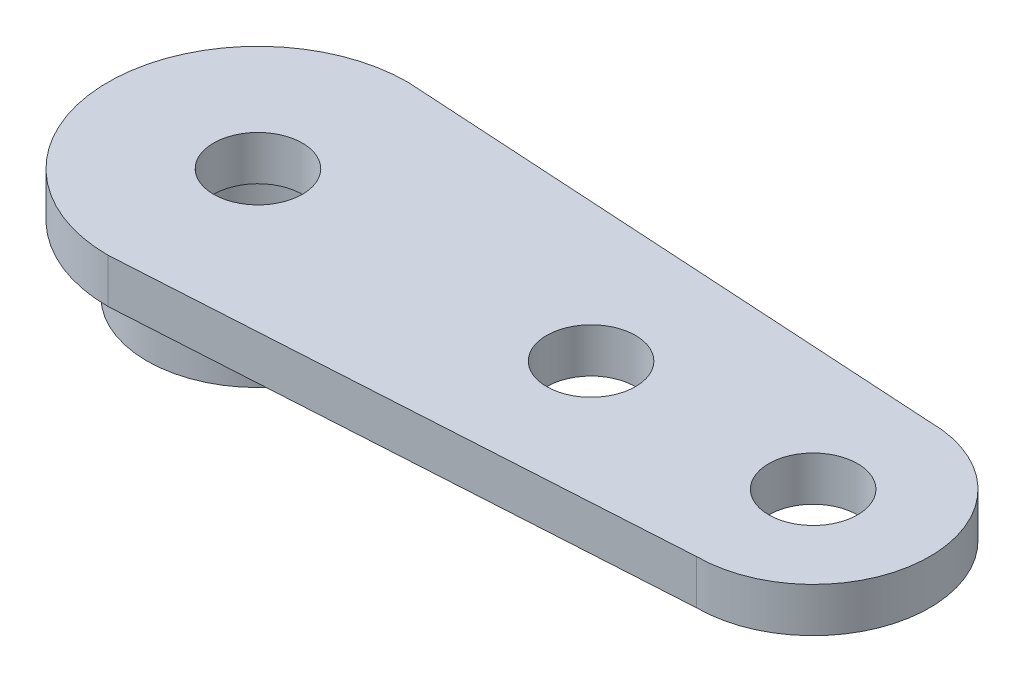
ISO-10303-21;
HEADER;
FILE_DESCRIPTION(('STEP AP214'),'2;1');
FILE_NAME('part.step','',(''),(''),'','','');
FILE_SCHEMA(('AUTOMOTIVE_DESIGN { 1 0 10303 214 1 1 1 1 }'));
ENDSEC;
DATA;
#1=APPLICATION_CONTEXT('core data for automotive mechanical design processes');
#2=APPLICATION_PROTOCOL_DEFINITION('international standard','automotive_design',2000,#1);
#3=PRODUCT_CONTEXT('',#1,'mechanical');
#4=PRODUCT('Part','Part','',(#3));
#5=PRODUCT_RELATED_PRODUCT_CATEGORY('part','',(#4));
#6=PRODUCT_DEFINITION_FORMATION('','',#4);
#7=PRODUCT_DEFINITION_CONTEXT('part definition',#1,'design');
#8=PRODUCT_DEFINITION('design','',#6,#7);
#9=PRODUCT_DEFINITION_SHAPE('','',#8);
#10=(LENGTH_UNIT() NAMED_UNIT(*) SI_UNIT(.MILLI.,.METRE.));
#11=(NAMED_UNIT(*) PLANE_ANGLE_UNIT() SI_UNIT($,.RADIAN.));
#12=(NAMED_UNIT(*) SI_UNIT($,.STERADIAN.) SOLID_ANGLE_UNIT());
#13=UNCERTAINTY_MEASURE_WITH_UNIT(LENGTH_MEASURE(1.E-05),#10,'distance_accuracy_value','');
#14=(GEOMETRIC_REPRESENTATION_CONTEXT(3) GLOBAL_UNCERTAINTY_ASSIGNED_CONTEXT((#13)) GLOBAL_UNIT_ASSIGNED_CONTEXT((#10,
#11,#12)) REPRESENTATION_CONTEXT('',''));
#15=CARTESIAN_POINT('',(0.,0.,0.));
#16=DIRECTION('',(0.,0.,1.));
#17=DIRECTION('',(1.,0.,0.));
#18=AXIS2_PLACEMENT_3D('',#15,#16,#17);
#19=CARTESIAN_POINT('',(0.,0.,0.));
#20=DIRECTION('',(0.,1.,0.));
#21=DIRECTION('',(0.,0.,1.));
#22=AXIS2_PLACEMENT_3D('',#19,#20,#21);
#23=PLANE('',#22);
#24=CARTESIAN_POINT('',(0.,0.,0.));
#25=DIRECTION('',(0.,1.,0.));
#26=DIRECTION('',(0.,0.,1.));
#27=AXIS2_PLACEMENT_3D('',#24,#25,#26);
#28=CIRCLE('',#27,1.);
#29=CARTESIAN_POINT('',(0.,0.,1.));
#30=VERTEX_POINT('',#29);
#31=EDGE_CURVE('E109',#30,#30,#28,.T.);
#32=ORIENTED_EDGE('',*,*,#31,.T.);
#33=EDGE_LOOP('',(#32));
#34=FACE_BOUND('',#33,.T.);
#35=CARTESIAN_POINT('',(0.,0.,0.));
#36=DIRECTION('',(0.,1.,0.));
#37=DIRECTION('',(0.,0.,1.));
#38=AXIS2_PLACEMENT_3D('',#35,#36,#37);
#39=CIRCLE('',#38,1.75);
#40=CARTESIAN_POINT('',(0.,0.,1.75));
#41=VERTEX_POINT('',#40);
#42=EDGE_CURVE('E11',#41,#41,#39,.T.);
#43=ORIENTED_EDGE('',*,*,#42,.F.);
#44=EDGE_LOOP('',(#43));
#45=FACE_BOUND('',#44,.T.);
#46=ADVANCED_FACE('F43',(#34,#45),#23,.F.);
#47=CARTESIAN_POINT('',(0.201773614986051,1.,3.36289358310084));
#48=DIRECTION('',(-0.0598922907279469,0.,-0.998204845465779));
#49=DIRECTION('',(-0.998204845465779,0.,0.0598922907279469));
#50=AXIS2_PLACEMENT_3D('',#47,#48,#49);
#51=PLANE('',#50);
#52=DIRECTION('',(0.998204845465779,0.,-0.0598922907279469));
#53=VECTOR('',#52,1.);
#54=CARTESIAN_POINT('',(0.201773614986051,0.,3.36289358310084));
#55=LINE('',#54,#53);
#56=CARTESIAN_POINT('',(0.,0.,3.375));
#57=VERTEX_POINT('',#56);
#58=CARTESIAN_POINT('',(12.5,0.,2.625));
#59=VERTEX_POINT('',#58);
#60=EDGE_CURVE('E119',#57,#59,#55,.T.);
#61=ORIENTED_EDGE('',*,*,#60,.T.);
#62=DIRECTION('',(0.,-1.,0.));
#63=VECTOR('',#62,1.);
#64=CARTESIAN_POINT('',(12.5,1.,2.625));
#65=LINE('',#64,#63);
#66=CARTESIAN_POINT('',(12.5,1.,2.625));
#67=VERTEX_POINT('',#66);
#68=EDGE_CURVE('E47',#67,#59,#65,.T.);
#69=ORIENTED_EDGE('',*,*,#68,.F.);
#70=DIRECTION('',(0.998204845465779,0.,-0.0598922907279469));
#71=VECTOR('',#70,1.);
#72=CARTESIAN_POINT('',(0.201773614986051,1.,3.36289358310084));
#73=LINE('',#72,#71);
#74=CARTESIAN_POINT('',(0.,1.,3.375));
#75=VERTEX_POINT('',#74);
#76=EDGE_CURVE('E93',#75,#67,#73,.T.);
#77=ORIENTED_EDGE('',*,*,#76,.F.);
#78=DIRECTION('',(0.,-1.,0.));
#79=VECTOR('',#78,1.);
#80=CARTESIAN_POINT('',(0.,1.,3.375));
#81=LINE('',#80,#79);
#82=EDGE_CURVE('E105',#75,#57,#81,.T.);
#83=ORIENTED_EDGE('',*,*,#82,.T.);
#84=EDGE_LOOP('',(#61,#69,#77,#83));
#85=FACE_BOUND('',#84,.T.);
#86=ADVANCED_FACE('F130',(#85),#51,.F.);
#87=CARTESIAN_POINT('',(12.5,1.,0.));
#88=DIRECTION('',(0.,-1.,0.));
#89=DIRECTION('',(0.,0.,-1.));
#90=AXIS2_PLACEMENT_3D('',#87,#88,#89);
#91=CYLINDRICAL_SURFACE('',#90,2.625);
#92=CARTESIAN_POINT('',(12.5,0.,0.));
#93=DIRECTION('',(0.,1.,0.));
#94=DIRECTION('',(0.,0.,1.));
#95=AXIS2_PLACEMENT_3D('',#92,#93,#94);
#96=CIRCLE('',#95,2.625);
#97=CARTESIAN_POINT('',(12.5,0.,-2.625));
#98=VERTEX_POINT('',#97);
#99=EDGE_CURVE('E99',#59,#98,#96,.T.);
#100=ORIENTED_EDGE('',*,*,#99,.T.);
#101=DIRECTION('',(0.,-1.,0.));
#102=VECTOR('',#101,1.);
#103=CARTESIAN_POINT('',(12.5,1.,-2.625));
#104=LINE('',#103,#102);
#105=CARTESIAN_POINT('',(12.5,1.,-2.625));
#106=VERTEX_POINT('',#105);
#107=EDGE_CURVE('E97',#106,#98,#104,.T.);
#108=ORIENTED_EDGE('',*,*,#107,.F.);
#109=CARTESIAN_POINT('',(12.5,1.,0.));
#110=DIRECTION('',(0.,1.,0.));
#111=DIRECTION('',(0.,0.,1.));
#112=AXIS2_PLACEMENT_3D('',#109,#110,#111);
#113=CIRCLE('',#112,2.625);
#114=EDGE_CURVE('E88',#67,#106,#113,.T.);
#115=ORIENTED_EDGE('',*,*,#114,.F.);
#116=ORIENTED_EDGE('',*,*,#68,.T.);
#117=EDGE_LOOP('',(#100,#108,#115,#116));
#118=FACE_BOUND('',#117,.T.);
#119=ADVANCED_FACE('F98',(#118),#91,.T.);
#120=CARTESIAN_POINT('',(0.201773614986051,1.,-3.36289358310084));
#121=DIRECTION('',(0.0598922907279469,0.,-0.998204845465779));
#122=DIRECTION('',(-0.998204845465779,0.,-0.0598922907279469));
#123=AXIS2_PLACEMENT_3D('',#120,#121,#122);
#124=PLANE('',#123);
#125=DIRECTION('',(0.998204845465779,0.,0.0598922907279469));
#126=VECTOR('',#125,1.);
#127=CARTESIAN_POINT('',(0.201773614986051,0.,-3.36289358310084));
#128=LINE('',#127,#126);
#129=CARTESIAN_POINT('',(0.,0.,-3.375));
#130=VERTEX_POINT('',#129);
#131=EDGE_CURVE('E123',#130,#98,#128,.T.);
#132=ORIENTED_EDGE('',*,*,#131,.F.);
#133=DIRECTION('',(0.,-1.,0.));
#134=VECTOR('',#133,1.);
#135=CARTESIAN_POINT('',(0.,1.,-3.375));
#136=LINE('',#135,#134);
#137=CARTESIAN_POINT('',(0.,1.,-3.375));
#138=VERTEX_POINT('',#137);
#139=EDGE_CURVE('E77',#138,#130,#136,.T.);
#140=ORIENTED_EDGE('',*,*,#139,.F.);
#141=DIRECTION('',(0.998204845465779,0.,0.0598922907279469));
#142=VECTOR('',#141,1.);
#143=CARTESIAN_POINT('',(0.201773614986051,1.,-3.36289358310084));
#144=LINE('',#143,#142);
#145=EDGE_CURVE('E91',#138,#106,#144,.T.);
#146=ORIENTED_EDGE('',*,*,#145,.T.);
#147=ORIENTED_EDGE('',*,*,#107,.T.);
#148=EDGE_LOOP('',(#132,#140,#146,#147));
#149=FACE_BOUND('',#148,.T.);
#150=ADVANCED_FACE('F103',(#149),#124,.T.);
#151=CARTESIAN_POINT('',(12.5,1.,0.));
#152=DIRECTION('',(0.,-1.,0.));
#153=DIRECTION('',(0.,0.,-1.));
#154=AXIS2_PLACEMENT_3D('',#151,#152,#153);
#155=CYLINDRICAL_SURFACE('',#154,1.);
#156=CARTESIAN_POINT('',(12.5,1.,0.));
#157=DIRECTION('',(0.,1.,0.));
#158=DIRECTION('',(0.,0.,1.));
#159=AXIS2_PLACEMENT_3D('',#156,#157,#158);
#160=CIRCLE('',#159,1.);
#161=CARTESIAN_POINT('',(12.5,1.,1.));
#162=VERTEX_POINT('',#161);
#163=EDGE_CURVE('E183',#162,#162,#160,.T.);
#164=ORIENTED_EDGE('',*,*,#163,.T.);
#165=EDGE_LOOP('',(#164));
#166=FACE_BOUND('',#165,.T.);
#167=CARTESIAN_POINT('',(12.5,0.,0.));
#168=DIRECTION('',(0.,1.,0.));
#169=DIRECTION('',(0.,0.,1.));
#170=AXIS2_PLACEMENT_3D('',#167,#168,#169);
#171=CIRCLE('',#170,1.);
#172=CARTESIAN_POINT('',(12.5,0.,1.));
#173=VERTEX_POINT('',#172);
#174=EDGE_CURVE('E116',#173,#173,#171,.T.);
#175=ORIENTED_EDGE('',*,*,#174,.F.);
#176=EDGE_LOOP('',(#175));
#177=FACE_BOUND('',#176,.T.);
#178=ADVANCED_FACE('F187',(#166,#177),#155,.F.);
#179=CARTESIAN_POINT('',(7.5,1.,0.));
#180=DIRECTION('',(0.,-1.,0.));
#181=DIRECTION('',(0.,0.,-1.));
#182=AXIS2_PLACEMENT_3D('',#179,#180,#181);
#183=CYLINDRICAL_SURFACE('',#182,1.);
#184=CARTESIAN_POINT('',(7.5,1.,0.));
#185=DIRECTION('',(0.,1.,0.));
#186=DIRECTION('',(0.,0.,1.));
#187=AXIS2_PLACEMENT_3D('',#184,#185,#186);
#188=CIRCLE('',#187,1.);
#189=CARTESIAN_POINT('',(7.5,1.,1.));
#190=VERTEX_POINT('',#189);
#191=EDGE_CURVE('E180',#190,#190,#188,.T.);
#192=ORIENTED_EDGE('',*,*,#191,.T.);
#193=EDGE_LOOP('',(#192));
#194=FACE_BOUND('',#193,.T.);
#195=CARTESIAN_POINT('',(7.5,0.,0.));
#196=DIRECTION('',(0.,1.,0.));
#197=DIRECTION('',(0.,0.,1.));
#198=AXIS2_PLACEMENT_3D('',#195,#196,#197);
#199=CIRCLE('',#198,1.);
#200=CARTESIAN_POINT('',(7.5,0.,1.));
#201=VERTEX_POINT('',#200);
#202=EDGE_CURVE('E112',#201,#201,#199,.T.);
#203=ORIENTED_EDGE('',*,*,#202,.F.);
#204=EDGE_LOOP('',(#203));
#205=FACE_BOUND('',#204,.T.);
#206=ADVANCED_FACE('F191',(#194,#205),#183,.F.);
#207=CARTESIAN_POINT('',(0.,1.,0.));
#208=DIRECTION('',(0.,-1.,0.));
#209=DIRECTION('',(0.,0.,-1.));
#210=AXIS2_PLACEMENT_3D('',#207,#208,#209);
#211=CYLINDRICAL_SURFACE('',#210,1.);
#212=CARTESIAN_POINT('',(0.,1.,0.));
#213=DIRECTION('',(0.,1.,0.));
#214=DIRECTION('',(0.,0.,1.));
#215=AXIS2_PLACEMENT_3D('',#212,#213,#214);
#216=CIRCLE('',#215,1.);
#217=CARTESIAN_POINT('',(0.,1.,1.));
#218=VERTEX_POINT('',#217);
#219=EDGE_CURVE('E126',#218,#218,#216,.T.);
#220=ORIENTED_EDGE('',*,*,#219,.T.);
#221=EDGE_LOOP('',(#220));
#222=FACE_BOUND('',#221,.T.);
#223=ORIENTED_EDGE('',*,*,#31,.F.);
#224=EDGE_LOOP('',(#223));
#225=FACE_BOUND('',#224,.T.);
#226=ADVANCED_FACE('F45',(#222,#225),#211,.F.);
#227=CARTESIAN_POINT('',(0.,1.,0.));
#228=DIRECTION('',(0.,-1.,0.));
#229=DIRECTION('',(0.,0.,-1.));
#230=AXIS2_PLACEMENT_3D('',#227,#228,#229);
#231=CYLINDRICAL_SURFACE('',#230,3.375);
#232=CARTESIAN_POINT('',(0.,0.,0.));
#233=DIRECTION('',(0.,1.,0.));
#234=DIRECTION('',(0.,0.,1.));
#235=AXIS2_PLACEMENT_3D('',#232,#233,#234);
#236=CIRCLE('',#235,3.375);
#237=EDGE_CURVE('E80',#130,#57,#236,.T.);
#238=ORIENTED_EDGE('',*,*,#237,.T.);
#239=ORIENTED_EDGE('',*,*,#82,.F.);
#240=CARTESIAN_POINT('',(0.,1.,0.));
#241=DIRECTION('',(0.,1.,0.));
#242=DIRECTION('',(0.,0.,1.));
#243=AXIS2_PLACEMENT_3D('',#240,#241,#242);
#244=CIRCLE('',#243,3.375);
#245=EDGE_CURVE('E61',#138,#75,#244,.T.);
#246=ORIENTED_EDGE('',*,*,#245,.F.);
#247=ORIENTED_EDGE('',*,*,#139,.T.);
#248=EDGE_LOOP('',(#238,#239,#246,#247));
#249=FACE_BOUND('',#248,.T.);
#250=ADVANCED_FACE('F145',(#249),#231,.T.);
#251=CARTESIAN_POINT('',(0.,1.,0.));
#252=DIRECTION('',(0.,1.,0.));
#253=DIRECTION('',(0.,0.,1.));
#254=AXIS2_PLACEMENT_3D('',#251,#252,#253);
#255=PLANE('',#254);
#256=ORIENTED_EDGE('',*,*,#219,.F.);
#257=EDGE_LOOP('',(#256));
#258=FACE_BOUND('',#257,.T.);
#259=ORIENTED_EDGE('',*,*,#191,.F.);
#260=EDGE_LOOP('',(#259));
#261=FACE_BOUND('',#260,.T.);
#262=ORIENTED_EDGE('',*,*,#163,.F.);
#263=EDGE_LOOP('',(#262));
#264=FACE_BOUND('',#263,.T.);
#265=ORIENTED_EDGE('',*,*,#76,.T.);
#266=ORIENTED_EDGE('',*,*,#114,.T.);
#267=ORIENTED_EDGE('',*,*,#145,.F.);
#268=ORIENTED_EDGE('',*,*,#245,.T.);
#269=EDGE_LOOP('',(#265,#266,#267,#268));
#270=FACE_BOUND('',#269,.T.);
#271=ADVANCED_FACE('F89',(#258,#261,#264,#270),#255,.T.);
#272=CARTESIAN_POINT('',(0.,0.,0.));
#273=DIRECTION('',(0.,1.,0.));
#274=DIRECTION('',(0.,0.,1.));
#275=AXIS2_PLACEMENT_3D('',#272,#273,#274);
#276=CIRCLE('',#275,2.5);
#277=CARTESIAN_POINT('',(0.,0.,2.5));
#278=VERTEX_POINT('',#277);
#279=EDGE_CURVE('E172',#278,#278,#276,.T.);
#280=ORIENTED_EDGE('',*,*,#279,.T.);
#281=EDGE_LOOP('',(#280));
#282=FACE_BOUND('',#281,.T.);
#283=ORIENTED_EDGE('',*,*,#202,.T.);
#284=EDGE_LOOP('',(#283));
#285=FACE_BOUND('',#284,.T.);
#286=ORIENTED_EDGE('',*,*,#174,.T.);
#287=EDGE_LOOP('',(#286));
#288=FACE_BOUND('',#287,.T.);
#289=ORIENTED_EDGE('',*,*,#60,.F.);
#290=ORIENTED_EDGE('',*,*,#237,.F.);
#291=ORIENTED_EDGE('',*,*,#131,.T.);
#292=ORIENTED_EDGE('',*,*,#99,.F.);
#293=EDGE_LOOP('',(#289,#290,#291,#292));
#294=FACE_BOUND('',#293,.T.);
#295=ADVANCED_FACE('F132',(#282,#285,#288,#294),#23,.F.);
#296=CARTESIAN_POINT('',(0.,-1.5,0.));
#297=DIRECTION('',(0.,1.,0.));
#298=DIRECTION('',(0.,0.,1.));
#299=AXIS2_PLACEMENT_3D('',#296,#297,#298);
#300=CYLINDRICAL_SURFACE('',#299,2.5);
#301=CARTESIAN_POINT('',(0.,-1.5,0.));
#302=DIRECTION('',(0.,1.,0.));
#303=DIRECTION('',(0.,0.,1.));
#304=AXIS2_PLACEMENT_3D('',#301,#302,#303);
#305=CIRCLE('',#304,2.5);
#306=CARTESIAN_POINT('',(0.,-1.5,2.5));
#307=VERTEX_POINT('',#306);
#308=EDGE_CURVE('E113',#307,#307,#305,.T.);
#309=ORIENTED_EDGE('',*,*,#308,.T.);
#310=EDGE_LOOP('',(#309));
#311=FACE_BOUND('',#310,.T.);
#312=ORIENTED_EDGE('',*,*,#279,.F.);
#313=EDGE_LOOP('',(#312));
#314=FACE_BOUND('',#313,.T.);
#315=ADVANCED_FACE('F134',(#311,#314),#300,.T.);
#316=CARTESIAN_POINT('',(0.,-1.5,0.));
#317=DIRECTION('',(0.,1.,0.));
#318=DIRECTION('',(0.,0.,1.));
#319=AXIS2_PLACEMENT_3D('',#316,#317,#318);
#320=PLANE('',#319);
#321=CARTESIAN_POINT('',(0.,-1.5,0.));
#322=DIRECTION('',(0.,1.,0.));
#323=DIRECTION('',(0.,0.,1.));
#324=AXIS2_PLACEMENT_3D('',#321,#322,#323);
#325=CIRCLE('',#324,1.75);
#326=CARTESIAN_POINT('',(0.,-1.5,1.75));
#327=VERTEX_POINT('',#326);
#328=EDGE_CURVE('E171',#327,#327,#325,.T.);
#329=ORIENTED_EDGE('',*,*,#328,.T.);
#330=EDGE_LOOP('',(#329));
#331=FACE_BOUND('',#330,.T.);
#332=ORIENTED_EDGE('',*,*,#308,.F.);
#333=EDGE_LOOP('',(#332));
#334=FACE_BOUND('',#333,.T.);
#335=ADVANCED_FACE('F141',(#331,#334),#320,.F.);
#336=CARTESIAN_POINT('',(0.,-1.5,0.));
#337=DIRECTION('',(0.,1.,0.));
#338=DIRECTION('',(0.,0.,1.));
#339=AXIS2_PLACEMENT_3D('',#336,#337,#338);
#340=CYLINDRICAL_SURFACE('',#339,1.75);
#341=ORIENTED_EDGE('',*,*,#328,.F.);
#342=EDGE_LOOP('',(#341));
#343=FACE_BOUND('',#342,.T.);
#344=ORIENTED_EDGE('',*,*,#42,.T.);
#345=EDGE_LOOP('',(#344));
#346=FACE_BOUND('',#345,.T.);
#347=ADVANCED_FACE('F160',(#343,#346),#340,.F.);
#348=CLOSED_SHELL('',(#46,#86,#119,#150,#178,#206,#226,#250,#271,#295,#315,#335,#347));
#349=MANIFOLD_SOLID_BREP('B2',#348);
#350=ADVANCED_BREP_SHAPE_REPRESENTATION('',(#18,#349),#14);
#351=SHAPE_DEFINITION_REPRESENTATION(#9,#350);
ENDSEC;
END-ISO-10303-21;
